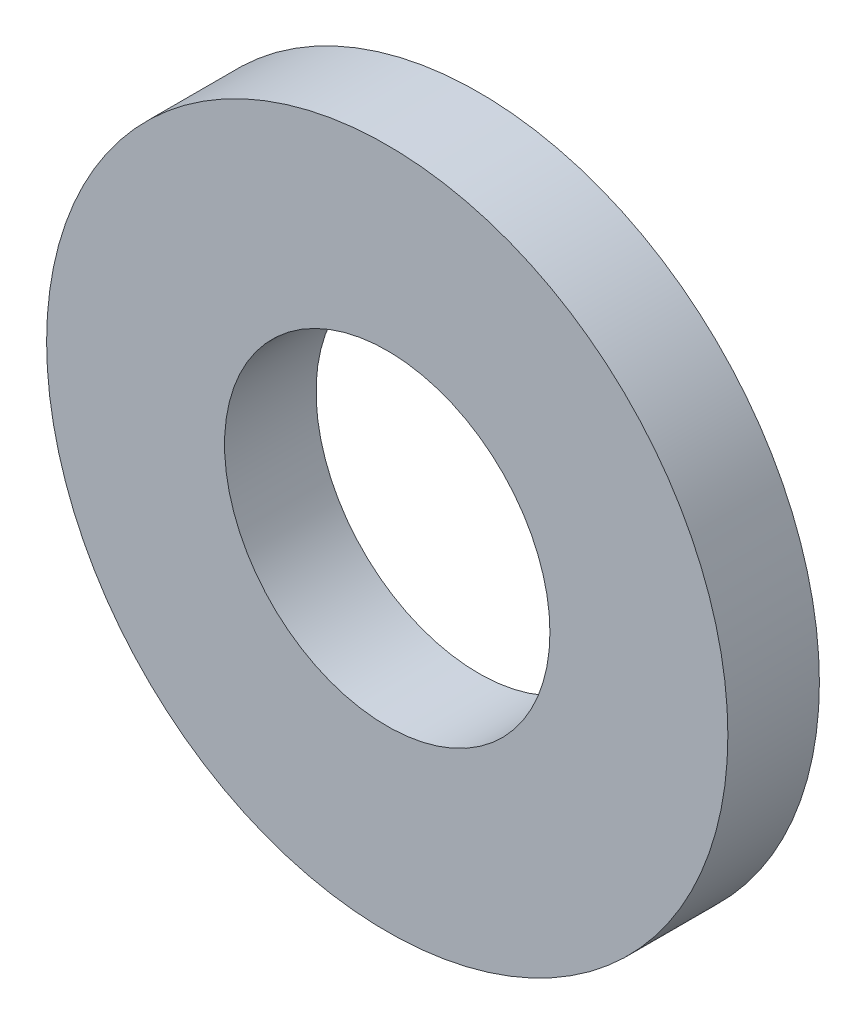
ISO-10303-21;
HEADER;
FILE_DESCRIPTION(('STEP AP214'),'2;1');
FILE_NAME('part.step','',(''),(''),'','','');
FILE_SCHEMA(('AUTOMOTIVE_DESIGN { 1 0 10303 214 1 1 1 1 }'));
ENDSEC;
DATA;
#1=APPLICATION_CONTEXT('core data for automotive mechanical design processes');
#2=APPLICATION_PROTOCOL_DEFINITION('international standard','automotive_design',2000,#1);
#3=PRODUCT_CONTEXT('',#1,'mechanical');
#4=PRODUCT('Part','Part','',(#3));
#5=PRODUCT_RELATED_PRODUCT_CATEGORY('part','',(#4));
#6=PRODUCT_DEFINITION_FORMATION('','',#4);
#7=PRODUCT_DEFINITION_CONTEXT('part definition',#1,'design');
#8=PRODUCT_DEFINITION('design','',#6,#7);
#9=PRODUCT_DEFINITION_SHAPE('','',#8);
#10=(LENGTH_UNIT() NAMED_UNIT(*) SI_UNIT(.MILLI.,.METRE.));
#11=(NAMED_UNIT(*) PLANE_ANGLE_UNIT() SI_UNIT($,.RADIAN.));
#12=(NAMED_UNIT(*) SI_UNIT($,.STERADIAN.) SOLID_ANGLE_UNIT());
#13=UNCERTAINTY_MEASURE_WITH_UNIT(LENGTH_MEASURE(1.E-05),#10,'distance_accuracy_value','');
#14=(GEOMETRIC_REPRESENTATION_CONTEXT(3) GLOBAL_UNCERTAINTY_ASSIGNED_CONTEXT((#13)) GLOBAL_UNIT_ASSIGNED_CONTEXT((#10,
#11,#12)) REPRESENTATION_CONTEXT('',''));
#15=CARTESIAN_POINT('',(0.,0.,0.));
#16=DIRECTION('',(0.,0.,1.));
#17=DIRECTION('',(1.,0.,0.));
#18=AXIS2_PLACEMENT_3D('',#15,#16,#17);
#19=CARTESIAN_POINT('',(0.,0.,0.9));
#20=DIRECTION('',(0.,0.,1.));
#21=DIRECTION('',(1.,0.,0.));
#22=AXIS2_PLACEMENT_3D('',#19,#20,#21);
#23=PLANE('',#22);
#24=CARTESIAN_POINT('',(0.,0.,0.9));
#25=DIRECTION('',(0.,0.,1.));
#26=DIRECTION('',(1.,0.,0.));
#27=AXIS2_PLACEMENT_3D('',#24,#25,#26);
#28=CIRCLE('',#27,3.35);
#29=CARTESIAN_POINT('',(3.35,0.,0.9));
#30=VERTEX_POINT('',#29);
#31=EDGE_CURVE('E10',#30,#30,#28,.T.);
#32=ORIENTED_EDGE('',*,*,#31,.T.);
#33=EDGE_LOOP('',(#32));
#34=FACE_BOUND('',#33,.T.);
#35=CARTESIAN_POINT('',(0.,0.,0.9));
#36=DIRECTION('',(0.,0.,1.));
#37=DIRECTION('',(1.,0.,0.));
#38=AXIS2_PLACEMENT_3D('',#35,#36,#37);
#39=CIRCLE('',#38,1.6);
#40=CARTESIAN_POINT('',(1.6,0.,0.9));
#41=VERTEX_POINT('',#40);
#42=EDGE_CURVE('E44',#41,#41,#39,.T.);
#43=ORIENTED_EDGE('',*,*,#42,.F.);
#44=EDGE_LOOP('',(#43));
#45=FACE_BOUND('',#44,.T.);
#46=ADVANCED_FACE('F33',(#34,#45),#23,.T.);
#47=CARTESIAN_POINT('',(0.,0.,0.));
#48=DIRECTION('',(0.,0.,1.));
#49=DIRECTION('',(1.,0.,0.));
#50=AXIS2_PLACEMENT_3D('',#47,#48,#49);
#51=PLANE('',#50);
#52=CARTESIAN_POINT('',(0.,0.,0.));
#53=DIRECTION('',(0.,0.,1.));
#54=DIRECTION('',(1.,0.,0.));
#55=AXIS2_PLACEMENT_3D('',#52,#53,#54);
#56=CIRCLE('',#55,3.35);
#57=CARTESIAN_POINT('',(3.35,0.,0.));
#58=VERTEX_POINT('',#57);
#59=EDGE_CURVE('E37',#58,#58,#56,.T.);
#60=ORIENTED_EDGE('',*,*,#59,.F.);
#61=EDGE_LOOP('',(#60));
#62=FACE_BOUND('',#61,.T.);
#63=CARTESIAN_POINT('',(0.,0.,0.));
#64=DIRECTION('',(0.,0.,1.));
#65=DIRECTION('',(1.,0.,0.));
#66=AXIS2_PLACEMENT_3D('',#63,#64,#65);
#67=CIRCLE('',#66,1.6);
#68=CARTESIAN_POINT('',(1.6,0.,0.));
#69=VERTEX_POINT('',#68);
#70=EDGE_CURVE('E46',#69,#69,#67,.T.);
#71=ORIENTED_EDGE('',*,*,#70,.T.);
#72=EDGE_LOOP('',(#71));
#73=FACE_BOUND('',#72,.T.);
#74=ADVANCED_FACE('F56',(#62,#73),#51,.F.);
#75=CARTESIAN_POINT('',(0.,0.,0.9));
#76=DIRECTION('',(0.,0.,-1.));
#77=DIRECTION('',(-1.,0.,0.));
#78=AXIS2_PLACEMENT_3D('',#75,#76,#77);
#79=CYLINDRICAL_SURFACE('',#78,3.35);
#80=ORIENTED_EDGE('',*,*,#31,.F.);
#81=EDGE_LOOP('',(#80));
#82=FACE_BOUND('',#81,.T.);
#83=ORIENTED_EDGE('',*,*,#59,.T.);
#84=EDGE_LOOP('',(#83));
#85=FACE_BOUND('',#84,.T.);
#86=ADVANCED_FACE('F35',(#82,#85),#79,.T.);
#87=CARTESIAN_POINT('',(0.,0.,0.9));
#88=DIRECTION('',(0.,0.,-1.));
#89=DIRECTION('',(-1.,0.,0.));
#90=AXIS2_PLACEMENT_3D('',#87,#88,#89);
#91=CYLINDRICAL_SURFACE('',#90,1.6);
#92=ORIENTED_EDGE('',*,*,#42,.T.);
#93=EDGE_LOOP('',(#92));
#94=FACE_BOUND('',#93,.T.);
#95=ORIENTED_EDGE('',*,*,#70,.F.);
#96=EDGE_LOOP('',(#95));
#97=FACE_BOUND('',#96,.T.);
#98=ADVANCED_FACE('F52',(#94,#97),#91,.F.);
#99=CLOSED_SHELL('',(#46,#74,#86,#98));
#100=MANIFOLD_SOLID_BREP('B2',#99);
#101=ADVANCED_BREP_SHAPE_REPRESENTATION('',(#18,#100),#14);
#102=SHAPE_DEFINITION_REPRESENTATION(#9,#101);
ENDSEC;
END-ISO-10303-21;
